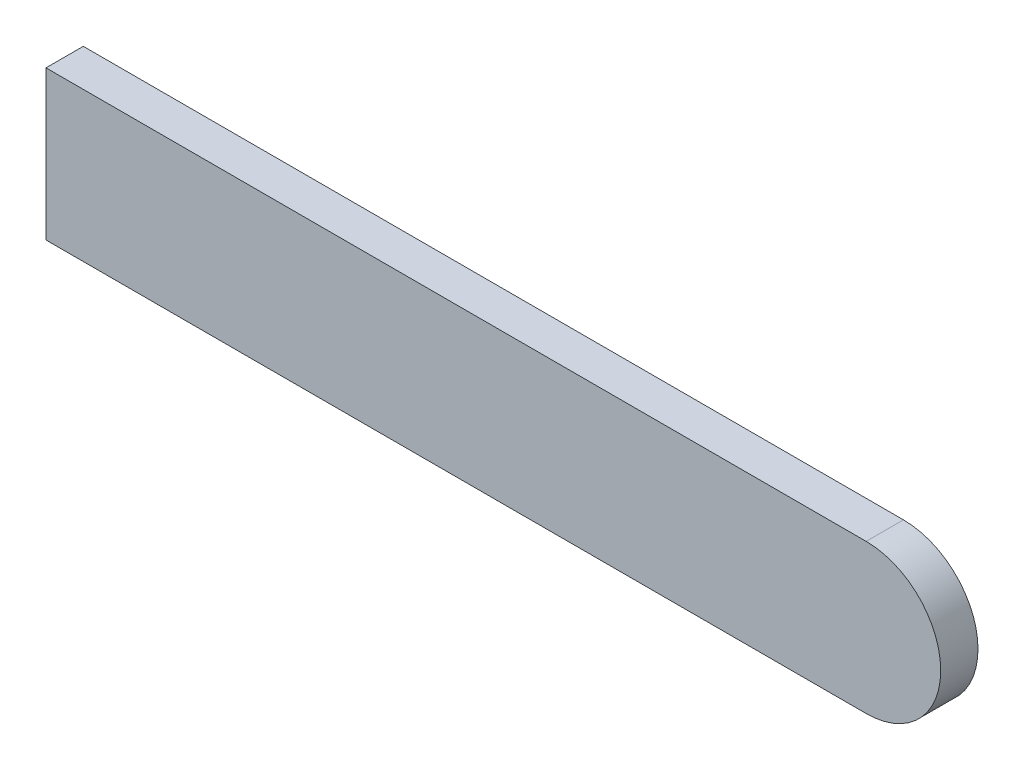
ISO-10303-21;
HEADER;
FILE_DESCRIPTION(('STEP AP214'),'2;1');
FILE_NAME('part.step','',(''),(''),'','','');
FILE_SCHEMA(('AUTOMOTIVE_DESIGN { 1 0 10303 214 1 1 1 1 }'));
ENDSEC;
DATA;
#1=APPLICATION_CONTEXT('core data for automotive mechanical design processes');
#2=APPLICATION_PROTOCOL_DEFINITION('international standard','automotive_design',2000,#1);
#3=PRODUCT_CONTEXT('',#1,'mechanical');
#4=PRODUCT('Part','Part','',(#3));
#5=PRODUCT_RELATED_PRODUCT_CATEGORY('part','',(#4));
#6=PRODUCT_DEFINITION_FORMATION('','',#4);
#7=PRODUCT_DEFINITION_CONTEXT('part definition',#1,'design');
#8=PRODUCT_DEFINITION('design','',#6,#7);
#9=PRODUCT_DEFINITION_SHAPE('','',#8);
#10=(LENGTH_UNIT() NAMED_UNIT(*) SI_UNIT(.MILLI.,.METRE.));
#11=(NAMED_UNIT(*) PLANE_ANGLE_UNIT() SI_UNIT($,.RADIAN.));
#12=(NAMED_UNIT(*) SI_UNIT($,.STERADIAN.) SOLID_ANGLE_UNIT());
#13=UNCERTAINTY_MEASURE_WITH_UNIT(LENGTH_MEASURE(1.E-05),#10,'distance_accuracy_value','');
#14=(GEOMETRIC_REPRESENTATION_CONTEXT(3) GLOBAL_UNCERTAINTY_ASSIGNED_CONTEXT((#13)) GLOBAL_UNIT_ASSIGNED_CONTEXT((#10,
#11,#12)) REPRESENTATION_CONTEXT('',''));
#15=CARTESIAN_POINT('',(0.,0.,0.));
#16=DIRECTION('',(0.,0.,1.));
#17=DIRECTION('',(1.,0.,0.));
#18=AXIS2_PLACEMENT_3D('',#15,#16,#17);
#19=CARTESIAN_POINT('',(-35.,10.,5.));
#20=DIRECTION('',(1.,0.,0.));
#21=DIRECTION('',(0.,1.,0.));
#22=AXIS2_PLACEMENT_3D('',#19,#20,#21);
#23=PLANE('',#22);
#24=DIRECTION('',(0.,-1.,0.));
#25=VECTOR('',#24,1.);
#26=CARTESIAN_POINT('',(-35.,10.,0.));
#27=LINE('',#26,#25);
#28=CARTESIAN_POINT('',(-35.,10.,0.));
#29=VERTEX_POINT('',#28);
#30=CARTESIAN_POINT('',(-35.,-10.,0.));
#31=VERTEX_POINT('',#30);
#32=EDGE_CURVE('E98',#29,#31,#27,.T.);
#33=ORIENTED_EDGE('',*,*,#32,.T.);
#34=DIRECTION('',(0.,0.,-1.));
#35=VECTOR('',#34,1.);
#36=CARTESIAN_POINT('',(-35.,-10.,5.));
#37=LINE('',#36,#35);
#38=CARTESIAN_POINT('',(-35.,-10.,5.));
#39=VERTEX_POINT('',#38);
#40=EDGE_CURVE('E11',#39,#31,#37,.T.);
#41=ORIENTED_EDGE('',*,*,#40,.F.);
#42=DIRECTION('',(0.,-1.,0.));
#43=VECTOR('',#42,1.);
#44=CARTESIAN_POINT('',(-35.,10.,5.));
#45=LINE('',#44,#43);
#46=CARTESIAN_POINT('',(-35.,10.,5.));
#47=VERTEX_POINT('',#46);
#48=EDGE_CURVE('E86',#47,#39,#45,.T.);
#49=ORIENTED_EDGE('',*,*,#48,.F.);
#50=DIRECTION('',(0.,0.,-1.));
#51=VECTOR('',#50,1.);
#52=CARTESIAN_POINT('',(-35.,10.,5.));
#53=LINE('',#52,#51);
#54=EDGE_CURVE('E94',#47,#29,#53,.T.);
#55=ORIENTED_EDGE('',*,*,#54,.T.);
#56=EDGE_LOOP('',(#33,#41,#49,#55));
#57=FACE_BOUND('',#56,.T.);
#58=ADVANCED_FACE('F35',(#57),#23,.F.);
#59=CARTESIAN_POINT('',(-35.,-10.,5.));
#60=DIRECTION('',(0.,1.,0.));
#61=DIRECTION('',(0.,0.,1.));
#62=AXIS2_PLACEMENT_3D('',#59,#60,#61);
#63=PLANE('',#62);
#64=DIRECTION('',(1.,0.,0.));
#65=VECTOR('',#64,1.);
#66=CARTESIAN_POINT('',(-35.,-10.,0.));
#67=LINE('',#66,#65);
#68=CARTESIAN_POINT('',(75.,-10.,0.));
#69=VERTEX_POINT('',#68);
#70=EDGE_CURVE('E90',#31,#69,#67,.T.);
#71=ORIENTED_EDGE('',*,*,#70,.T.);
#72=DIRECTION('',(0.,0.,-1.));
#73=VECTOR('',#72,1.);
#74=CARTESIAN_POINT('',(75.,-10.,5.));
#75=LINE('',#74,#73);
#76=CARTESIAN_POINT('',(75.,-10.,5.));
#77=VERTEX_POINT('',#76);
#78=EDGE_CURVE('E43',#77,#69,#75,.T.);
#79=ORIENTED_EDGE('',*,*,#78,.F.);
#80=DIRECTION('',(1.,0.,0.));
#81=VECTOR('',#80,1.);
#82=CARTESIAN_POINT('',(-35.,-10.,5.));
#83=LINE('',#82,#81);
#84=EDGE_CURVE('E81',#39,#77,#83,.T.);
#85=ORIENTED_EDGE('',*,*,#84,.F.);
#86=ORIENTED_EDGE('',*,*,#40,.T.);
#87=EDGE_LOOP('',(#71,#79,#85,#86));
#88=FACE_BOUND('',#87,.T.);
#89=ADVANCED_FACE('F89',(#88),#63,.F.);
#90=CARTESIAN_POINT('',(75.,0.,5.));
#91=DIRECTION('',(0.,0.,-1.));
#92=DIRECTION('',(-1.,0.,0.));
#93=AXIS2_PLACEMENT_3D('',#90,#91,#92);
#94=CYLINDRICAL_SURFACE('',#93,10.);
#95=CARTESIAN_POINT('',(75.,0.,0.));
#96=DIRECTION('',(0.,0.,1.));
#97=DIRECTION('',(1.,0.,0.));
#98=AXIS2_PLACEMENT_3D('',#95,#96,#97);
#99=CIRCLE('',#98,10.);
#100=CARTESIAN_POINT('',(75.,10.,0.));
#101=VERTEX_POINT('',#100);
#102=EDGE_CURVE('E68',#69,#101,#99,.T.);
#103=ORIENTED_EDGE('',*,*,#102,.T.);
#104=DIRECTION('',(0.,0.,-1.));
#105=VECTOR('',#104,1.);
#106=CARTESIAN_POINT('',(75.,10.,5.));
#107=LINE('',#106,#105);
#108=CARTESIAN_POINT('',(75.,10.,5.));
#109=VERTEX_POINT('',#108);
#110=EDGE_CURVE('E91',#109,#101,#107,.T.);
#111=ORIENTED_EDGE('',*,*,#110,.F.);
#112=CARTESIAN_POINT('',(75.,0.,5.));
#113=DIRECTION('',(0.,0.,1.));
#114=DIRECTION('',(1.,0.,0.));
#115=AXIS2_PLACEMENT_3D('',#112,#113,#114);
#116=CIRCLE('',#115,10.);
#117=EDGE_CURVE('E84',#77,#109,#116,.T.);
#118=ORIENTED_EDGE('',*,*,#117,.F.);
#119=ORIENTED_EDGE('',*,*,#78,.T.);
#120=EDGE_LOOP('',(#103,#111,#118,#119));
#121=FACE_BOUND('',#120,.T.);
#122=ADVANCED_FACE('F92',(#121),#94,.T.);
#123=CARTESIAN_POINT('',(-35.,10.,5.));
#124=DIRECTION('',(0.,-1.,0.));
#125=DIRECTION('',(0.,0.,-1.));
#126=AXIS2_PLACEMENT_3D('',#123,#124,#125);
#127=PLANE('',#126);
#128=DIRECTION('',(-1.,0.,0.));
#129=VECTOR('',#128,1.);
#130=CARTESIAN_POINT('',(-35.,10.,0.));
#131=LINE('',#130,#129);
#132=EDGE_CURVE('E74',#101,#29,#131,.T.);
#133=ORIENTED_EDGE('',*,*,#132,.T.);
#134=ORIENTED_EDGE('',*,*,#54,.F.);
#135=DIRECTION('',(-1.,0.,0.));
#136=VECTOR('',#135,1.);
#137=CARTESIAN_POINT('',(-35.,10.,5.));
#138=LINE('',#137,#136);
#139=EDGE_CURVE('E51',#109,#47,#138,.T.);
#140=ORIENTED_EDGE('',*,*,#139,.F.);
#141=ORIENTED_EDGE('',*,*,#110,.T.);
#142=EDGE_LOOP('',(#133,#134,#140,#141));
#143=FACE_BOUND('',#142,.T.);
#144=ADVANCED_FACE('F105',(#143),#127,.F.);
#145=CARTESIAN_POINT('',(75.,0.,5.));
#146=DIRECTION('',(0.,0.,1.));
#147=DIRECTION('',(1.,0.,0.));
#148=AXIS2_PLACEMENT_3D('',#145,#146,#147);
#149=PLANE('',#148);
#150=ORIENTED_EDGE('',*,*,#48,.T.);
#151=ORIENTED_EDGE('',*,*,#84,.T.);
#152=ORIENTED_EDGE('',*,*,#117,.T.);
#153=ORIENTED_EDGE('',*,*,#139,.T.);
#154=EDGE_LOOP('',(#150,#151,#152,#153));
#155=FACE_BOUND('',#154,.T.);
#156=ADVANCED_FACE('F82',(#155),#149,.T.);
#157=CARTESIAN_POINT('',(75.,0.,0.));
#158=DIRECTION('',(0.,0.,1.));
#159=DIRECTION('',(1.,0.,0.));
#160=AXIS2_PLACEMENT_3D('',#157,#158,#159);
#161=PLANE('',#160);
#162=ORIENTED_EDGE('',*,*,#32,.F.);
#163=ORIENTED_EDGE('',*,*,#132,.F.);
#164=ORIENTED_EDGE('',*,*,#102,.F.);
#165=ORIENTED_EDGE('',*,*,#70,.F.);
#166=EDGE_LOOP('',(#162,#163,#164,#165));
#167=FACE_BOUND('',#166,.T.);
#168=ADVANCED_FACE('F108',(#167),#161,.F.);
#169=CLOSED_SHELL('',(#58,#89,#122,#144,#156,#168));
#170=MANIFOLD_SOLID_BREP('B2',#169);
#171=ADVANCED_BREP_SHAPE_REPRESENTATION('',(#18,#170),#14);
#172=SHAPE_DEFINITION_REPRESENTATION(#9,#171);
ENDSEC;
END-ISO-10303-21;
